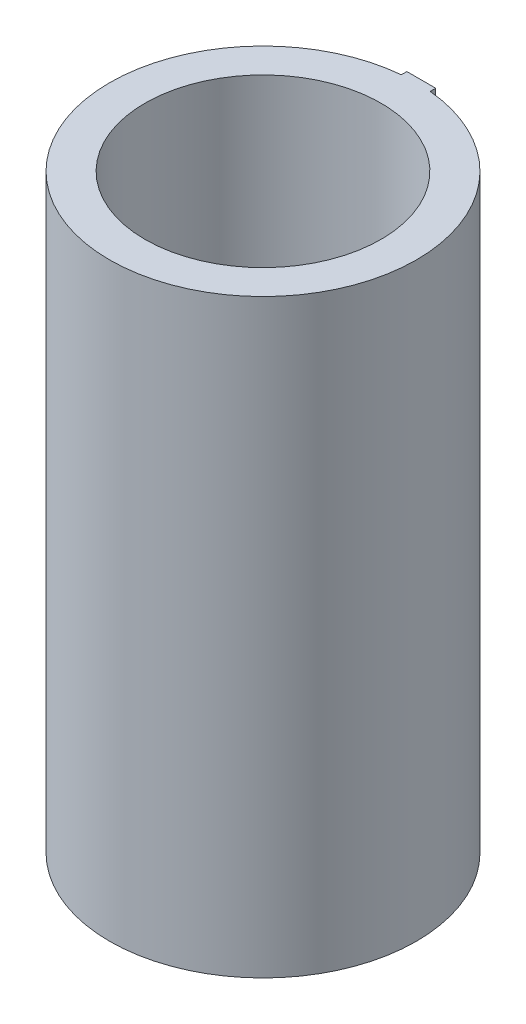
ISO-10303-21;
HEADER;
FILE_DESCRIPTION(('STEP AP214'),'2;1');
FILE_NAME('part.step','',(''),(''),'','','');
FILE_SCHEMA(('AUTOMOTIVE_DESIGN { 1 0 10303 214 1 1 1 1 }'));
ENDSEC;
DATA;
#1=APPLICATION_CONTEXT('core data for automotive mechanical design processes');
#2=APPLICATION_PROTOCOL_DEFINITION('international standard','automotive_design',2000,#1);
#3=PRODUCT_CONTEXT('',#1,'mechanical');
#4=PRODUCT('Part','Part','',(#3));
#5=PRODUCT_RELATED_PRODUCT_CATEGORY('part','',(#4));
#6=PRODUCT_DEFINITION_FORMATION('','',#4);
#7=PRODUCT_DEFINITION_CONTEXT('part definition',#1,'design');
#8=PRODUCT_DEFINITION('design','',#6,#7);
#9=PRODUCT_DEFINITION_SHAPE('','',#8);
#10=(LENGTH_UNIT() NAMED_UNIT(*) SI_UNIT(.MILLI.,.METRE.));
#11=(NAMED_UNIT(*) PLANE_ANGLE_UNIT() SI_UNIT($,.RADIAN.));
#12=(NAMED_UNIT(*) SI_UNIT($,.STERADIAN.) SOLID_ANGLE_UNIT());
#13=UNCERTAINTY_MEASURE_WITH_UNIT(LENGTH_MEASURE(1.E-05),#10,'distance_accuracy_value','');
#14=(GEOMETRIC_REPRESENTATION_CONTEXT(3) GLOBAL_UNCERTAINTY_ASSIGNED_CONTEXT((#13)) GLOBAL_UNIT_ASSIGNED_CONTEXT((#10,
#11,#12)) REPRESENTATION_CONTEXT('',''));
#15=CARTESIAN_POINT('',(0.,0.,0.));
#16=DIRECTION('',(0.,0.,1.));
#17=DIRECTION('',(1.,0.,0.));
#18=AXIS2_PLACEMENT_3D('',#15,#16,#17);
#19=CARTESIAN_POINT('',(0.,50.,0.));
#20=DIRECTION('',(0.,1.,0.));
#21=DIRECTION('',(0.,0.,1.));
#22=AXIS2_PLACEMENT_3D('',#19,#20,#21);
#23=PLANE('',#22);
#24=CARTESIAN_POINT('',(0.,50.,0.));
#25=DIRECTION('',(0.,1.,0.));
#26=DIRECTION('',(0.,0.,1.));
#27=AXIS2_PLACEMENT_3D('',#24,#25,#26);
#28=CIRCLE('',#27,13.);
#29=CARTESIAN_POINT('',(-1.22216115613424,50.,-12.9424233475975));
#30=VERTEX_POINT('',#29);
#31=CARTESIAN_POINT('',(1.22216115613424,50.,-12.9424233475975));
#32=VERTEX_POINT('',#31);
#33=EDGE_CURVE('E52',#30,#32,#28,.T.);
#34=ORIENTED_EDGE('',*,*,#33,.T.);
#35=DIRECTION('',(0.,0.,-1.));
#36=VECTOR('',#35,1.);
#37=CARTESIAN_POINT('',(1.22216115613424,50.,-13.4117400918172));
#38=LINE('',#37,#36);
#39=CARTESIAN_POINT('',(1.22216115613424,50.,-13.4117400918172));
#40=VERTEX_POINT('',#39);
#41=EDGE_CURVE('E72',#32,#40,#38,.T.);
#42=ORIENTED_EDGE('',*,*,#41,.T.);
#43=DIRECTION('',(-1.,0.,0.));
#44=VECTOR('',#43,1.);
#45=CARTESIAN_POINT('',(-1.22216115613424,50.,-13.4117400918172));
#46=LINE('',#45,#44);
#47=CARTESIAN_POINT('',(-1.22216115613424,50.,-13.4117400918172));
#48=VERTEX_POINT('',#47);
#49=EDGE_CURVE('E77',#40,#48,#46,.T.);
#50=ORIENTED_EDGE('',*,*,#49,.T.);
#51=DIRECTION('',(0.,0.,1.));
#52=VECTOR('',#51,1.);
#53=CARTESIAN_POINT('',(-1.22216115613424,50.,-13.4117400918172));
#54=LINE('',#53,#52);
#55=EDGE_CURVE('E89',#48,#30,#54,.T.);
#56=ORIENTED_EDGE('',*,*,#55,.T.);
#57=EDGE_LOOP('',(#34,#42,#50,#56));
#58=FACE_BOUND('',#57,.T.);
#59=CARTESIAN_POINT('',(0.,50.,0.));
#60=DIRECTION('',(0.,1.,0.));
#61=DIRECTION('',(0.,0.,1.));
#62=AXIS2_PLACEMENT_3D('',#59,#60,#61);
#63=CIRCLE('',#62,10.);
#64=CARTESIAN_POINT('',(0.,50.,10.));
#65=VERTEX_POINT('',#64);
#66=EDGE_CURVE('E103',#65,#65,#63,.T.);
#67=ORIENTED_EDGE('',*,*,#66,.F.);
#68=EDGE_LOOP('',(#67));
#69=FACE_BOUND('',#68,.T.);
#70=ADVANCED_FACE('F33',(#58,#69),#23,.T.);
#71=CARTESIAN_POINT('',(0.,0.,0.));
#72=DIRECTION('',(0.,1.,0.));
#73=DIRECTION('',(0.,0.,1.));
#74=AXIS2_PLACEMENT_3D('',#71,#72,#73);
#75=PLANE('',#74);
#76=DIRECTION('',(0.,0.,1.));
#77=VECTOR('',#76,1.);
#78=CARTESIAN_POINT('',(1.22216115613424,0.,-13.4117400918172));
#79=LINE('',#78,#77);
#80=CARTESIAN_POINT('',(1.22216115613424,0.,-13.4117400918172));
#81=VERTEX_POINT('',#80);
#82=CARTESIAN_POINT('',(1.22216115613424,0.,-12.9424233475975));
#83=VERTEX_POINT('',#82);
#84=EDGE_CURVE('E85',#81,#83,#79,.T.);
#85=ORIENTED_EDGE('',*,*,#84,.T.);
#86=CARTESIAN_POINT('',(0.,0.,0.));
#87=DIRECTION('',(0.,1.,0.));
#88=DIRECTION('',(0.,0.,1.));
#89=AXIS2_PLACEMENT_3D('',#86,#87,#88);
#90=CIRCLE('',#89,13.);
#91=CARTESIAN_POINT('',(-1.22216115613424,0.,-12.9424233475975));
#92=VERTEX_POINT('',#91);
#93=EDGE_CURVE('E47',#92,#83,#90,.T.);
#94=ORIENTED_EDGE('',*,*,#93,.F.);
#95=DIRECTION('',(0.,0.,-1.));
#96=VECTOR('',#95,1.);
#97=CARTESIAN_POINT('',(-1.22216115613424,0.,-13.4117400918172));
#98=LINE('',#97,#96);
#99=CARTESIAN_POINT('',(-1.22216115613424,0.,-13.4117400918172));
#100=VERTEX_POINT('',#99);
#101=EDGE_CURVE('E98',#92,#100,#98,.T.);
#102=ORIENTED_EDGE('',*,*,#101,.T.);
#103=DIRECTION('',(1.,0.,0.));
#104=VECTOR('',#103,1.);
#105=CARTESIAN_POINT('',(-1.22216115613424,0.,-13.4117400918172));
#106=LINE('',#105,#104);
#107=EDGE_CURVE('E100',#100,#81,#106,.T.);
#108=ORIENTED_EDGE('',*,*,#107,.T.);
#109=EDGE_LOOP('',(#85,#94,#102,#108));
#110=FACE_BOUND('',#109,.T.);
#111=CARTESIAN_POINT('',(0.,0.,0.));
#112=DIRECTION('',(0.,1.,0.));
#113=DIRECTION('',(0.,0.,1.));
#114=AXIS2_PLACEMENT_3D('',#111,#112,#113);
#115=CIRCLE('',#114,10.);
#116=CARTESIAN_POINT('',(0.,0.,10.));
#117=VERTEX_POINT('',#116);
#118=EDGE_CURVE('E102',#117,#117,#115,.T.);
#119=ORIENTED_EDGE('',*,*,#118,.T.);
#120=EDGE_LOOP('',(#119));
#121=FACE_BOUND('',#120,.T.);
#122=ADVANCED_FACE('F114',(#110,#121),#75,.F.);
#123=CARTESIAN_POINT('',(0.,50.,0.));
#124=DIRECTION('',(0.,-1.,0.));
#125=DIRECTION('',(0.,0.,-1.));
#126=AXIS2_PLACEMENT_3D('',#123,#124,#125);
#127=CYLINDRICAL_SURFACE('',#126,13.);
#128=ORIENTED_EDGE('',*,*,#93,.T.);
#129=DIRECTION('',(0.,-1.,0.));
#130=VECTOR('',#129,1.);
#131=CARTESIAN_POINT('',(1.22216115613424,50.,-12.9424233475975));
#132=LINE('',#131,#130);
#133=EDGE_CURVE('E11',#83,#32,#132,.F.);
#134=ORIENTED_EDGE('',*,*,#133,.T.);
#135=ORIENTED_EDGE('',*,*,#33,.F.);
#136=DIRECTION('',(0.,-1.,0.));
#137=VECTOR('',#136,1.);
#138=CARTESIAN_POINT('',(-1.22216115613424,50.,-12.9424233475975));
#139=LINE('',#138,#137);
#140=EDGE_CURVE('E41',#30,#92,#139,.T.);
#141=ORIENTED_EDGE('',*,*,#140,.T.);
#142=EDGE_LOOP('',(#128,#134,#135,#141));
#143=FACE_BOUND('',#142,.T.);
#144=ADVANCED_FACE('F35',(#143),#127,.T.);
#145=CARTESIAN_POINT('',(0.,50.,0.));
#146=DIRECTION('',(0.,-1.,0.));
#147=DIRECTION('',(0.,0.,-1.));
#148=AXIS2_PLACEMENT_3D('',#145,#146,#147);
#149=CYLINDRICAL_SURFACE('',#148,10.);
#150=ORIENTED_EDGE('',*,*,#66,.T.);
#151=EDGE_LOOP('',(#150));
#152=FACE_BOUND('',#151,.T.);
#153=ORIENTED_EDGE('',*,*,#118,.F.);
#154=EDGE_LOOP('',(#153));
#155=FACE_BOUND('',#154,.T.);
#156=ADVANCED_FACE('F119',(#152,#155),#149,.F.);
#157=CARTESIAN_POINT('',(1.22216115613424,-2.57930827531182,-13.4117400918172));
#158=DIRECTION('',(1.,0.,0.));
#159=DIRECTION('',(0.,0.,-1.));
#160=AXIS2_PLACEMENT_3D('',#157,#158,#159);
#161=PLANE('',#160);
#162=ORIENTED_EDGE('',*,*,#133,.F.);
#163=ORIENTED_EDGE('',*,*,#84,.F.);
#164=DIRECTION('',(0.,1.,0.));
#165=VECTOR('',#164,1.);
#166=CARTESIAN_POINT('',(1.22216115613424,-2.57930827531182,-13.4117400918172));
#167=LINE('',#166,#165);
#168=EDGE_CURVE('E82',#81,#40,#167,.T.);
#169=ORIENTED_EDGE('',*,*,#168,.T.);
#170=ORIENTED_EDGE('',*,*,#41,.F.);
#171=EDGE_LOOP('',(#162,#163,#169,#170));
#172=FACE_BOUND('',#171,.T.);
#173=ADVANCED_FACE('F83',(#172),#161,.T.);
#174=CARTESIAN_POINT('',(-1.22216115613424,-2.57930827531182,-13.4117400918172));
#175=DIRECTION('',(-1.,0.,0.));
#176=DIRECTION('',(0.,0.,1.));
#177=AXIS2_PLACEMENT_3D('',#174,#175,#176);
#178=PLANE('',#177);
#179=ORIENTED_EDGE('',*,*,#140,.F.);
#180=ORIENTED_EDGE('',*,*,#55,.F.);
#181=DIRECTION('',(0.,1.,0.));
#182=VECTOR('',#181,1.);
#183=CARTESIAN_POINT('',(-1.22216115613424,-2.57930827531182,-13.4117400918172));
#184=LINE('',#183,#182);
#185=EDGE_CURVE('E88',#100,#48,#184,.T.);
#186=ORIENTED_EDGE('',*,*,#185,.F.);
#187=ORIENTED_EDGE('',*,*,#101,.F.);
#188=EDGE_LOOP('',(#179,#180,#186,#187));
#189=FACE_BOUND('',#188,.T.);
#190=ADVANCED_FACE('F111',(#189),#178,.T.);
#191=CARTESIAN_POINT('',(-1.22216115613424,-2.57930827531182,-13.4117400918172));
#192=DIRECTION('',(0.,0.,-1.));
#193=DIRECTION('',(-1.,0.,0.));
#194=AXIS2_PLACEMENT_3D('',#191,#192,#193);
#195=PLANE('',#194);
#196=ORIENTED_EDGE('',*,*,#107,.F.);
#197=ORIENTED_EDGE('',*,*,#185,.T.);
#198=ORIENTED_EDGE('',*,*,#49,.F.);
#199=ORIENTED_EDGE('',*,*,#168,.F.);
#200=EDGE_LOOP('',(#196,#197,#198,#199));
#201=FACE_BOUND('',#200,.T.);
#202=ADVANCED_FACE('F91',(#201),#195,.T.);
#203=CLOSED_SHELL('',(#70,#122,#144,#156,#173,#190,#202));
#204=MANIFOLD_SOLID_BREP('B2',#203);
#205=ADVANCED_BREP_SHAPE_REPRESENTATION('',(#18,#204),#14);
#206=SHAPE_DEFINITION_REPRESENTATION(#9,#205);
ENDSEC;
END-ISO-10303-21;
